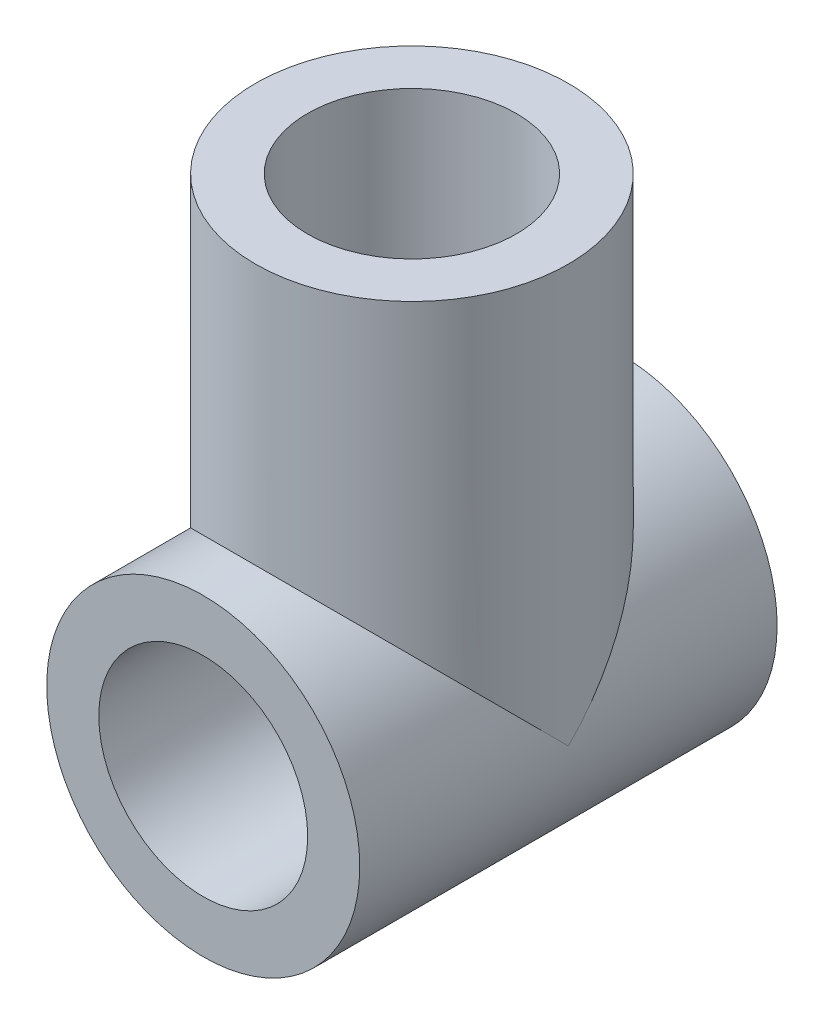
ISO-10303-21;
HEADER;
FILE_DESCRIPTION(('STEP AP214'),'2;1');
FILE_NAME('part.step','',(''),(''),'','','');
FILE_SCHEMA(('AUTOMOTIVE_DESIGN { 1 0 10303 214 1 1 1 1 }'));
ENDSEC;
DATA;
#1=APPLICATION_CONTEXT('core data for automotive mechanical design processes');
#2=APPLICATION_PROTOCOL_DEFINITION('international standard','automotive_design',2000,#1);
#3=PRODUCT_CONTEXT('',#1,'mechanical');
#4=PRODUCT('Part','Part','',(#3));
#5=PRODUCT_RELATED_PRODUCT_CATEGORY('part','',(#4));
#6=PRODUCT_DEFINITION_FORMATION('','',#4);
#7=PRODUCT_DEFINITION_CONTEXT('part definition',#1,'design');
#8=PRODUCT_DEFINITION('design','',#6,#7);
#9=PRODUCT_DEFINITION_SHAPE('','',#8);
#10=(LENGTH_UNIT() NAMED_UNIT(*) SI_UNIT(.MILLI.,.METRE.));
#11=(NAMED_UNIT(*) PLANE_ANGLE_UNIT() SI_UNIT($,.RADIAN.));
#12=(NAMED_UNIT(*) SI_UNIT($,.STERADIAN.) SOLID_ANGLE_UNIT());
#13=UNCERTAINTY_MEASURE_WITH_UNIT(LENGTH_MEASURE(1.E-05),#10,'distance_accuracy_value','');
#14=(GEOMETRIC_REPRESENTATION_CONTEXT(3) GLOBAL_UNCERTAINTY_ASSIGNED_CONTEXT((#13)) GLOBAL_UNIT_ASSIGNED_CONTEXT((#10,
#11,#12)) REPRESENTATION_CONTEXT('',''));
#15=CARTESIAN_POINT('',(0.,0.,0.));
#16=DIRECTION('',(0.,0.,1.));
#17=DIRECTION('',(1.,0.,0.));
#18=AXIS2_PLACEMENT_3D('',#15,#16,#17);
#19=CARTESIAN_POINT('',(0.,0.,-10.));
#20=DIRECTION('',(0.,0.,1.));
#21=DIRECTION('',(1.,0.,0.));
#22=AXIS2_PLACEMENT_3D('',#19,#20,#21);
#23=CYLINDRICAL_SURFACE('',#22,7.5);
#24=CARTESIAN_POINT('',(0.,0.,0.));
#25=DIRECTION('',(0.,0.707106781186547,0.707106781186547));
#26=DIRECTION('',(0.,-0.707106781186547,0.707106781186547));
#27=AXIS2_PLACEMENT_3D('',#24,#25,#26);
#28=ELLIPSE('',#27,10.6066017177982,7.5);
#29=CARTESIAN_POINT('',(7.5,0.,0.));
#30=VERTEX_POINT('',#29);
#31=CARTESIAN_POINT('',(-7.5,0.,0.));
#32=VERTEX_POINT('',#31);
#33=EDGE_CURVE('E11',#30,#32,#28,.T.);
#34=ORIENTED_EDGE('',*,*,#33,.F.);
#35=CARTESIAN_POINT('',(0.,0.,0.));
#36=DIRECTION('',(0.,-0.707106781186547,0.707106781186547));
#37=DIRECTION('',(0.,0.707106781186547,0.707106781186547));
#38=AXIS2_PLACEMENT_3D('',#35,#36,#37);
#39=ELLIPSE('',#38,10.6066017177982,7.5);
#40=EDGE_CURVE('E40',#32,#30,#39,.F.);
#41=ORIENTED_EDGE('',*,*,#40,.F.);
#42=EDGE_LOOP('',(#34,#41));
#43=FACE_BOUND('',#42,.T.);
#44=CARTESIAN_POINT('',(0.,0.,-10.));
#45=DIRECTION('',(0.,0.,1.));
#46=DIRECTION('',(1.,0.,0.));
#47=AXIS2_PLACEMENT_3D('',#44,#45,#46);
#48=CIRCLE('',#47,7.5);
#49=CARTESIAN_POINT('',(7.5,0.,-10.));
#50=VERTEX_POINT('',#49);
#51=EDGE_CURVE('E50',#50,#50,#48,.T.);
#52=ORIENTED_EDGE('',*,*,#51,.T.);
#53=EDGE_LOOP('',(#52));
#54=FACE_BOUND('',#53,.T.);
#55=CARTESIAN_POINT('',(0.,0.,10.));
#56=DIRECTION('',(0.,0.,1.));
#57=DIRECTION('',(1.,0.,0.));
#58=AXIS2_PLACEMENT_3D('',#55,#56,#57);
#59=CIRCLE('',#58,7.5);
#60=CARTESIAN_POINT('',(7.5,0.,10.));
#61=VERTEX_POINT('',#60);
#62=EDGE_CURVE('E52',#61,#61,#59,.T.);
#63=ORIENTED_EDGE('',*,*,#62,.F.);
#64=EDGE_LOOP('',(#63));
#65=FACE_BOUND('',#64,.T.);
#66=ADVANCED_FACE('F33',(#43,#54,#65),#23,.T.);
#67=CARTESIAN_POINT('',(0.,0.,-10.));
#68=DIRECTION('',(0.,0.,1.));
#69=DIRECTION('',(1.,0.,0.));
#70=AXIS2_PLACEMENT_3D('',#67,#68,#69);
#71=PLANE('',#70);
#72=CARTESIAN_POINT('',(0.,0.,-10.));
#73=DIRECTION('',(0.,0.,1.));
#74=DIRECTION('',(1.,0.,0.));
#75=AXIS2_PLACEMENT_3D('',#72,#73,#74);
#76=CIRCLE('',#75,5.005);
#77=CARTESIAN_POINT('',(5.005,0.,-10.));
#78=VERTEX_POINT('',#77);
#79=EDGE_CURVE('E60',#78,#78,#76,.T.);
#80=ORIENTED_EDGE('',*,*,#79,.T.);
#81=EDGE_LOOP('',(#80));
#82=FACE_BOUND('',#81,.T.);
#83=ORIENTED_EDGE('',*,*,#51,.F.);
#84=EDGE_LOOP('',(#83));
#85=FACE_BOUND('',#84,.T.);
#86=ADVANCED_FACE('F93',(#82,#85),#71,.F.);
#87=CARTESIAN_POINT('',(0.,0.,10.));
#88=DIRECTION('',(0.,0.,1.));
#89=DIRECTION('',(1.,0.,0.));
#90=AXIS2_PLACEMENT_3D('',#87,#88,#89);
#91=PLANE('',#90);
#92=CARTESIAN_POINT('',(0.,0.,10.));
#93=DIRECTION('',(0.,0.,1.));
#94=DIRECTION('',(1.,0.,0.));
#95=AXIS2_PLACEMENT_3D('',#92,#93,#94);
#96=CIRCLE('',#95,5.005);
#97=CARTESIAN_POINT('',(5.005,0.,10.));
#98=VERTEX_POINT('',#97);
#99=EDGE_CURVE('E63',#98,#98,#96,.T.);
#100=ORIENTED_EDGE('',*,*,#99,.F.);
#101=EDGE_LOOP('',(#100));
#102=FACE_BOUND('',#101,.T.);
#103=ORIENTED_EDGE('',*,*,#62,.T.);
#104=EDGE_LOOP('',(#103));
#105=FACE_BOUND('',#104,.T.);
#106=ADVANCED_FACE('F88',(#102,#105),#91,.T.);
#107=CARTESIAN_POINT('',(0.,0.,0.));
#108=DIRECTION('',(0.,1.,0.));
#109=DIRECTION('',(0.,0.,1.));
#110=AXIS2_PLACEMENT_3D('',#107,#108,#109);
#111=CYLINDRICAL_SURFACE('',#110,7.5);
#112=ORIENTED_EDGE('',*,*,#40,.T.);
#113=ORIENTED_EDGE('',*,*,#33,.T.);
#114=EDGE_LOOP('',(#112,#113));
#115=FACE_BOUND('',#114,.T.);
#116=CARTESIAN_POINT('',(0.,20.,0.));
#117=DIRECTION('',(0.,1.,0.));
#118=DIRECTION('',(0.,0.,1.));
#119=AXIS2_PLACEMENT_3D('',#116,#117,#118);
#120=CIRCLE('',#119,7.5);
#121=CARTESIAN_POINT('',(0.,20.,7.5));
#122=VERTEX_POINT('',#121);
#123=EDGE_CURVE('E57',#122,#122,#120,.T.);
#124=ORIENTED_EDGE('',*,*,#123,.F.);
#125=EDGE_LOOP('',(#124));
#126=FACE_BOUND('',#125,.T.);
#127=ADVANCED_FACE('F48',(#115,#126),#111,.T.);
#128=CARTESIAN_POINT('',(0.,20.,0.));
#129=DIRECTION('',(0.,1.,0.));
#130=DIRECTION('',(0.,0.,1.));
#131=AXIS2_PLACEMENT_3D('',#128,#129,#130);
#132=PLANE('',#131);
#133=CARTESIAN_POINT('',(0.,20.,0.));
#134=DIRECTION('',(0.,1.,0.));
#135=DIRECTION('',(0.,0.,1.));
#136=AXIS2_PLACEMENT_3D('',#133,#134,#135);
#137=CIRCLE('',#136,5.005);
#138=CARTESIAN_POINT('',(0.,20.,5.005));
#139=VERTEX_POINT('',#138);
#140=EDGE_CURVE('E67',#139,#139,#137,.T.);
#141=ORIENTED_EDGE('',*,*,#140,.F.);
#142=EDGE_LOOP('',(#141));
#143=FACE_BOUND('',#142,.T.);
#144=ORIENTED_EDGE('',*,*,#123,.T.);
#145=EDGE_LOOP('',(#144));
#146=FACE_BOUND('',#145,.T.);
#147=ADVANCED_FACE('F82',(#143,#146),#132,.T.);
#148=CARTESIAN_POINT('',(0.,0.,-13.));
#149=DIRECTION('',(0.,0.,1.));
#150=DIRECTION('',(1.,0.,0.));
#151=AXIS2_PLACEMENT_3D('',#148,#149,#150);
#152=CYLINDRICAL_SURFACE('',#151,5.005);
#153=ORIENTED_EDGE('',*,*,#99,.T.);
#154=EDGE_LOOP('',(#153));
#155=FACE_BOUND('',#154,.T.);
#156=ORIENTED_EDGE('',*,*,#79,.F.);
#157=EDGE_LOOP('',(#156));
#158=FACE_BOUND('',#157,.T.);
#159=ADVANCED_FACE('F78',(#155,#158),#152,.F.);
#160=CARTESIAN_POINT('',(0.,11.,0.));
#161=DIRECTION('',(0.,1.,0.));
#162=DIRECTION('',(0.,0.,1.));
#163=AXIS2_PLACEMENT_3D('',#160,#161,#162);
#164=CYLINDRICAL_SURFACE('',#163,5.005);
#165=CARTESIAN_POINT('',(0.,11.,0.));
#166=DIRECTION('',(0.,1.,0.));
#167=DIRECTION('',(0.,0.,1.));
#168=AXIS2_PLACEMENT_3D('',#165,#166,#167);
#169=CIRCLE('',#168,5.005);
#170=CARTESIAN_POINT('',(0.,11.,5.005));
#171=VERTEX_POINT('',#170);
#172=EDGE_CURVE('E66',#171,#171,#169,.T.);
#173=ORIENTED_EDGE('',*,*,#172,.F.);
#174=EDGE_LOOP('',(#173));
#175=FACE_BOUND('',#174,.T.);
#176=ORIENTED_EDGE('',*,*,#140,.T.);
#177=EDGE_LOOP('',(#176));
#178=FACE_BOUND('',#177,.T.);
#179=ADVANCED_FACE('F75',(#175,#178),#164,.F.);
#180=CARTESIAN_POINT('',(0.,11.,0.));
#181=DIRECTION('',(0.,1.,0.));
#182=DIRECTION('',(0.,0.,1.));
#183=AXIS2_PLACEMENT_3D('',#180,#181,#182);
#184=PLANE('',#183);
#185=ORIENTED_EDGE('',*,*,#172,.T.);
#186=EDGE_LOOP('',(#185));
#187=FACE_BOUND('',#186,.T.);
#188=ADVANCED_FACE('F73',(#187),#184,.T.);
#189=CLOSED_SHELL('',(#66,#86,#106,#127,#147,#159,#179,#188));
#190=MANIFOLD_SOLID_BREP('B2',#189);
#191=ADVANCED_BREP_SHAPE_REPRESENTATION('',(#18,#190),#14);
#192=SHAPE_DEFINITION_REPRESENTATION(#9,#191);
ENDSEC;
END-ISO-10303-21;
